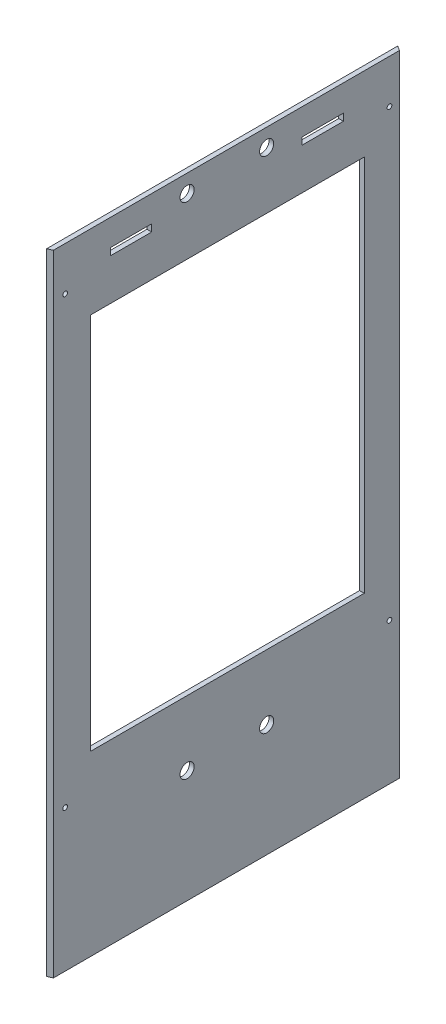
ISO-10303-21;
HEADER;
FILE_DESCRIPTION(('STEP AP214'),'2;1');
FILE_NAME('part.step','',(''),(''),'','','');
FILE_SCHEMA(('AUTOMOTIVE_DESIGN { 1 0 10303 214 1 1 1 1 }'));
ENDSEC;
DATA;
#1=APPLICATION_CONTEXT('core data for automotive mechanical design processes');
#2=APPLICATION_PROTOCOL_DEFINITION('international standard','automotive_design',2000,#1);
#3=PRODUCT_CONTEXT('',#1,'mechanical');
#4=PRODUCT('Part','Part','',(#3));
#5=PRODUCT_RELATED_PRODUCT_CATEGORY('part','',(#4));
#6=PRODUCT_DEFINITION_FORMATION('','',#4);
#7=PRODUCT_DEFINITION_CONTEXT('part definition',#1,'design');
#8=PRODUCT_DEFINITION('design','',#6,#7);
#9=PRODUCT_DEFINITION_SHAPE('','',#8);
#10=(LENGTH_UNIT() NAMED_UNIT(*) SI_UNIT(.MILLI.,.METRE.));
#11=(NAMED_UNIT(*) PLANE_ANGLE_UNIT() SI_UNIT($,.RADIAN.));
#12=(NAMED_UNIT(*) SI_UNIT($,.STERADIAN.) SOLID_ANGLE_UNIT());
#13=UNCERTAINTY_MEASURE_WITH_UNIT(LENGTH_MEASURE(1.E-05),#10,'distance_accuracy_value','');
#14=(GEOMETRIC_REPRESENTATION_CONTEXT(3) GLOBAL_UNCERTAINTY_ASSIGNED_CONTEXT((#13)) GLOBAL_UNIT_ASSIGNED_CONTEXT((#10,
#11,#12)) REPRESENTATION_CONTEXT('',''));
#15=CARTESIAN_POINT('',(0.,0.,0.));
#16=DIRECTION('',(0.,0.,1.));
#17=DIRECTION('',(1.,0.,0.));
#18=AXIS2_PLACEMENT_3D('',#15,#16,#17);
#19=CARTESIAN_POINT('',(0.,831.128163857922,0.));
#20=DIRECTION('',(1.,0.,0.));
#21=DIRECTION('',(0.,0.,-1.));
#22=AXIS2_PLACEMENT_3D('',#19,#20,#21);
#23=PLANE('',#22);
#24=CARTESIAN_POINT('',(0.,120.,-11.7241962206973));
#25=DIRECTION('',(-1.,0.,0.));
#26=DIRECTION('',(0.,0.,-1.));
#27=AXIS2_PLACEMENT_3D('',#24,#25,#26);
#28=CIRCLE('',#27,2.);
#29=CARTESIAN_POINT('',(0.,120.,-13.7241962206973));
#30=VERTEX_POINT('',#29);
#31=EDGE_CURVE('E391',#30,#30,#28,.T.);
#32=ORIENTED_EDGE('',*,*,#31,.F.);
#33=EDGE_LOOP('',(#32));
#34=FACE_BOUND('',#33,.T.);
#35=CARTESIAN_POINT('',(0.,120.,-286.387590837121));
#36=DIRECTION('',(-1.,0.,0.));
#37=DIRECTION('',(0.,0.,1.));
#38=AXIS2_PLACEMENT_3D('',#35,#36,#37);
#39=CIRCLE('',#38,2.);
#40=CARTESIAN_POINT('',(0.,120.,-284.387590837121));
#41=VERTEX_POINT('',#40);
#42=EDGE_CURVE('E393',#41,#41,#39,.T.);
#43=ORIENTED_EDGE('',*,*,#42,.F.);
#44=EDGE_LOOP('',(#43));
#45=FACE_BOUND('',#44,.T.);
#46=CARTESIAN_POINT('',(0.,496.713673316679,-11.7241962206973));
#47=DIRECTION('',(-1.,0.,0.));
#48=DIRECTION('',(0.,0.,-1.));
#49=AXIS2_PLACEMENT_3D('',#46,#47,#48);
#50=CIRCLE('',#49,2.);
#51=CARTESIAN_POINT('',(0.,496.713673316679,-13.7241962206973));
#52=VERTEX_POINT('',#51);
#53=EDGE_CURVE('E399',#52,#52,#50,.T.);
#54=ORIENTED_EDGE('',*,*,#53,.F.);
#55=EDGE_LOOP('',(#54));
#56=FACE_BOUND('',#55,.T.);
#57=CARTESIAN_POINT('',(0.,496.713673316679,-286.387590837121));
#58=DIRECTION('',(-1.,0.,0.));
#59=DIRECTION('',(0.,0.,1.));
#60=AXIS2_PLACEMENT_3D('',#57,#58,#59);
#61=CIRCLE('',#60,2.);
#62=CARTESIAN_POINT('',(0.,496.713673316679,-284.387590837121));
#63=VERTEX_POINT('',#62);
#64=EDGE_CURVE('E405',#63,#63,#61,.T.);
#65=ORIENTED_EDGE('',*,*,#64,.F.);
#66=EDGE_LOOP('',(#65));
#67=FACE_BOUND('',#66,.T.);
#68=CARTESIAN_POINT('',(0.,95.5,-115.));
#69=DIRECTION('',(-1.,0.,0.));
#70=DIRECTION('',(0.,0.,1.));
#71=AXIS2_PLACEMENT_3D('',#68,#69,#70);
#72=CIRCLE('',#71,6.);
#73=CARTESIAN_POINT('',(0.,95.5,-109.));
#74=VERTEX_POINT('',#73);
#75=EDGE_CURVE('E411',#74,#74,#72,.T.);
#76=ORIENTED_EDGE('',*,*,#75,.F.);
#77=EDGE_LOOP('',(#76));
#78=FACE_BOUND('',#77,.T.);
#79=CARTESIAN_POINT('',(0.,95.5,-182.387590837121));
#80=DIRECTION('',(-1.,0.,0.));
#81=DIRECTION('',(0.,0.,1.));
#82=AXIS2_PLACEMENT_3D('',#79,#80,#81);
#83=CIRCLE('',#82,6.00000000000002);
#84=CARTESIAN_POINT('',(0.,95.5,-176.387590837121));
#85=VERTEX_POINT('',#84);
#86=EDGE_CURVE('E417',#85,#85,#83,.T.);
#87=ORIENTED_EDGE('',*,*,#86,.F.);
#88=EDGE_LOOP('',(#87));
#89=FACE_BOUND('',#88,.T.);
#90=CARTESIAN_POINT('',(0.,518.713673316679,-115.));
#91=DIRECTION('',(-1.,0.,0.));
#92=DIRECTION('',(0.,0.,1.));
#93=AXIS2_PLACEMENT_3D('',#90,#91,#92);
#94=CIRCLE('',#93,6.);
#95=CARTESIAN_POINT('',(0.,518.713673316679,-109.));
#96=VERTEX_POINT('',#95);
#97=EDGE_CURVE('E423',#96,#96,#94,.T.);
#98=ORIENTED_EDGE('',*,*,#97,.F.);
#99=EDGE_LOOP('',(#98));
#100=FACE_BOUND('',#99,.T.);
#101=CARTESIAN_POINT('',(0.,518.713673316679,-182.387590837121));
#102=DIRECTION('',(-1.,0.,0.));
#103=DIRECTION('',(0.,0.,1.));
#104=AXIS2_PLACEMENT_3D('',#101,#102,#103);
#105=CIRCLE('',#104,6.00000000000002);
#106=CARTESIAN_POINT('',(0.,518.713673316679,-176.387590837121));
#107=VERTEX_POINT('',#106);
#108=EDGE_CURVE('E172',#107,#107,#105,.T.);
#109=ORIENTED_EDGE('',*,*,#108,.F.);
#110=EDGE_LOOP('',(#109));
#111=FACE_BOUND('',#110,.T.);
#112=DIRECTION('',(0.,1.,0.));
#113=VECTOR('',#112,1.);
#114=CARTESIAN_POINT('',(0.,505.500000000006,-50.));
#115=LINE('',#114,#113);
#116=CARTESIAN_POINT('',(0.,505.500000000006,-50.));
#117=VERTEX_POINT('',#116);
#118=CARTESIAN_POINT('',(0.,511.5,-50.));
#119=VERTEX_POINT('',#118);
#120=EDGE_CURVE('E178',#117,#119,#115,.T.);
#121=ORIENTED_EDGE('',*,*,#120,.F.);
#122=DIRECTION('',(0.,1.74463618155382E-13,1.));
#123=VECTOR('',#122,1.);
#124=CARTESIAN_POINT('',(0.,505.500000000006,-50.));
#125=LINE('',#124,#123);
#126=CARTESIAN_POINT('',(0.,505.5,-85.));
#127=VERTEX_POINT('',#126);
#128=EDGE_CURVE('E50',#127,#117,#125,.T.);
#129=ORIENTED_EDGE('',*,*,#128,.F.);
#130=DIRECTION('',(0.,-1.,0.));
#131=VECTOR('',#130,1.);
#132=CARTESIAN_POINT('',(0.,505.5,-85.));
#133=LINE('',#132,#131);
#134=CARTESIAN_POINT('',(0.,511.5,-85.));
#135=VERTEX_POINT('',#134);
#136=EDGE_CURVE('E166',#135,#127,#133,.T.);
#137=ORIENTED_EDGE('',*,*,#136,.F.);
#138=DIRECTION('',(0.,0.,-1.));
#139=VECTOR('',#138,1.);
#140=CARTESIAN_POINT('',(0.,511.5,-50.));
#141=LINE('',#140,#139);
#142=EDGE_CURVE('E169',#119,#135,#141,.T.);
#143=ORIENTED_EDGE('',*,*,#142,.F.);
#144=EDGE_LOOP('',(#121,#129,#137,#143));
#145=FACE_BOUND('',#144,.T.);
#146=DIRECTION('',(0.,-1.74463618155382E-13,1.));
#147=VECTOR('',#146,1.);
#148=CARTESIAN_POINT('',(0.,505.500000000006,-247.387590837121));
#149=LINE('',#148,#147);
#150=CARTESIAN_POINT('',(0.,505.500000000006,-247.387590837121));
#151=VERTEX_POINT('',#150);
#152=CARTESIAN_POINT('',(0.,505.5,-212.387590837121));
#153=VERTEX_POINT('',#152);
#154=EDGE_CURVE('E204',#151,#153,#149,.T.);
#155=ORIENTED_EDGE('',*,*,#154,.F.);
#156=DIRECTION('',(0.,-1.,0.));
#157=VECTOR('',#156,1.);
#158=CARTESIAN_POINT('',(0.,505.500000000006,-247.387590837121));
#159=LINE('',#158,#157);
#160=CARTESIAN_POINT('',(0.,511.5,-247.387590837121));
#161=VERTEX_POINT('',#160);
#162=EDGE_CURVE('E185',#161,#151,#159,.T.);
#163=ORIENTED_EDGE('',*,*,#162,.F.);
#164=DIRECTION('',(0.,0.,-1.));
#165=VECTOR('',#164,1.);
#166=CARTESIAN_POINT('',(0.,511.5,-247.387590837121));
#167=LINE('',#166,#165);
#168=CARTESIAN_POINT('',(0.,511.5,-212.387590837121));
#169=VERTEX_POINT('',#168);
#170=EDGE_CURVE('E193',#169,#161,#167,.T.);
#171=ORIENTED_EDGE('',*,*,#170,.F.);
#172=DIRECTION('',(0.,1.,0.));
#173=VECTOR('',#172,1.);
#174=CARTESIAN_POINT('',(0.,505.5,-212.387590837121));
#175=LINE('',#174,#173);
#176=EDGE_CURVE('E207',#153,#169,#175,.T.);
#177=ORIENTED_EDGE('',*,*,#176,.F.);
#178=EDGE_LOOP('',(#155,#163,#171,#177));
#179=FACE_BOUND('',#178,.T.);
#180=DIRECTION('',(0.,0.,1.));
#181=VECTOR('',#180,1.);
#182=CARTESIAN_POINT('',(0.,150.5,-33.0558935288884));
#183=LINE('',#182,#181);
#184=CARTESIAN_POINT('',(0.,150.5,-265.055893528888));
#185=VERTEX_POINT('',#184);
#186=CARTESIAN_POINT('',(0.,150.5,-33.0558935288884));
#187=VERTEX_POINT('',#186);
#188=EDGE_CURVE('E236',#185,#187,#183,.T.);
#189=ORIENTED_EDGE('',*,*,#188,.F.);
#190=DIRECTION('',(0.,-1.,0.));
#191=VECTOR('',#190,1.);
#192=CARTESIAN_POINT('',(0.,150.5,-265.055893528888));
#193=LINE('',#192,#191);
#194=CARTESIAN_POINT('',(0.,470.5,-265.055893528888));
#195=VERTEX_POINT('',#194);
#196=EDGE_CURVE('E214',#195,#185,#193,.T.);
#197=ORIENTED_EDGE('',*,*,#196,.F.);
#198=DIRECTION('',(0.,0.,-1.));
#199=VECTOR('',#198,1.);
#200=CARTESIAN_POINT('',(0.,470.5,-33.0558935288884));
#201=LINE('',#200,#199);
#202=CARTESIAN_POINT('',(0.,470.5,-33.0558935288884));
#203=VERTEX_POINT('',#202);
#204=EDGE_CURVE('E225',#203,#195,#201,.T.);
#205=ORIENTED_EDGE('',*,*,#204,.F.);
#206=DIRECTION('',(0.,1.,0.));
#207=VECTOR('',#206,1.);
#208=CARTESIAN_POINT('',(0.,150.5,-33.0558935288884));
#209=LINE('',#208,#207);
#210=EDGE_CURVE('E239',#187,#203,#209,.T.);
#211=ORIENTED_EDGE('',*,*,#210,.F.);
#212=EDGE_LOOP('',(#189,#197,#205,#211));
#213=FACE_BOUND('',#212,.T.);
#214=DIRECTION('',(0.,0.,1.));
#215=VECTOR('',#214,1.);
#216=CARTESIAN_POINT('',(0.,533.713673316679,0.));
#217=LINE('',#216,#215);
#218=CARTESIAN_POINT('',(0.,533.713673316679,-297.387590837121));
#219=VERTEX_POINT('',#218);
#220=CARTESIAN_POINT('',(0.,533.713673316679,0.));
#221=VERTEX_POINT('',#220);
#222=EDGE_CURVE('E270',#219,#221,#217,.T.);
#223=ORIENTED_EDGE('',*,*,#222,.F.);
#224=DIRECTION('',(0.,-1.,0.));
#225=VECTOR('',#224,1.);
#226=CARTESIAN_POINT('',(0.,831.128163857922,-297.387590837121));
#227=LINE('',#226,#225);
#228=CARTESIAN_POINT('',(0.,0.,-297.387590837121));
#229=VERTEX_POINT('',#228);
#230=EDGE_CURVE('E37',#219,#229,#227,.T.);
#231=ORIENTED_EDGE('',*,*,#230,.T.);
#232=DIRECTION('',(0.,0.,1.));
#233=VECTOR('',#232,1.);
#234=CARTESIAN_POINT('',(0.,0.,0.));
#235=LINE('',#234,#233);
#236=CARTESIAN_POINT('',(0.,0.,0.));
#237=VERTEX_POINT('',#236);
#238=EDGE_CURVE('E265',#229,#237,#235,.T.);
#239=ORIENTED_EDGE('',*,*,#238,.T.);
#240=DIRECTION('',(0.,-1.,0.));
#241=VECTOR('',#240,1.);
#242=CARTESIAN_POINT('',(0.,831.128163857922,0.));
#243=LINE('',#242,#241);
#244=EDGE_CURVE('E264',#221,#237,#243,.T.);
#245=ORIENTED_EDGE('',*,*,#244,.F.);
#246=EDGE_LOOP('',(#223,#231,#239,#245));
#247=FACE_BOUND('',#246,.T.);
#248=ADVANCED_FACE('F33',(#34,#45,#56,#67,#78,#89,#100,#111,#145,#179,#213,#247),#23,.F.);
#249=CARTESIAN_POINT('',(0.,831.128163857922,0.));
#250=DIRECTION('',(-0.403602443988454,0.,-0.914934460607178));
#251=DIRECTION('',(-0.914934460607178,0.,0.403602443988454));
#252=AXIS2_PLACEMENT_3D('',#249,#250,#251);
#253=PLANE('',#252);
#254=DIRECTION('',(0.914934460607178,0.,-0.403602443988454));
#255=VECTOR('',#254,1.);
#256=CARTESIAN_POINT('',(0.,533.713673316679,0.));
#257=LINE('',#256,#255);
#258=CARTESIAN_POINT('',(4.,533.713673316679,-1.76450865658994));
#259=VERTEX_POINT('',#258);
#260=EDGE_CURVE('E42',#221,#259,#257,.T.);
#261=ORIENTED_EDGE('',*,*,#260,.F.);
#262=ORIENTED_EDGE('',*,*,#244,.T.);
#263=DIRECTION('',(0.914934460607178,0.,-0.403602443988454));
#264=VECTOR('',#263,1.);
#265=CARTESIAN_POINT('',(0.,0.,0.));
#266=LINE('',#265,#264);
#267=CARTESIAN_POINT('',(4.,0.,-1.76450865658994));
#268=VERTEX_POINT('',#267);
#269=EDGE_CURVE('E261',#237,#268,#266,.T.);
#270=ORIENTED_EDGE('',*,*,#269,.T.);
#271=DIRECTION('',(0.,-1.,0.));
#272=VECTOR('',#271,1.);
#273=CARTESIAN_POINT('',(4.,831.128163857922,-1.76450865658994));
#274=LINE('',#273,#272);
#275=EDGE_CURVE('E260',#259,#268,#274,.T.);
#276=ORIENTED_EDGE('',*,*,#275,.F.);
#277=EDGE_LOOP('',(#261,#262,#270,#276));
#278=FACE_BOUND('',#277,.T.);
#279=ADVANCED_FACE('F292',(#278),#253,.F.);
#280=CARTESIAN_POINT('',(4.,831.128163857922,-1.76450865658994));
#281=DIRECTION('',(-1.,0.,0.));
#282=DIRECTION('',(0.,0.,1.));
#283=AXIS2_PLACEMENT_3D('',#280,#281,#282);
#284=PLANE('',#283);
#285=CARTESIAN_POINT('',(4.,120.,-11.7241962206973));
#286=DIRECTION('',(-1.,0.,0.));
#287=DIRECTION('',(0.,0.,-1.));
#288=AXIS2_PLACEMENT_3D('',#285,#286,#287);
#289=CIRCLE('',#288,2.);
#290=CARTESIAN_POINT('',(4.,120.,-13.7241962206973));
#291=VERTEX_POINT('',#290);
#292=EDGE_CURVE('E388',#291,#291,#289,.T.);
#293=ORIENTED_EDGE('',*,*,#292,.T.);
#294=EDGE_LOOP('',(#293));
#295=FACE_BOUND('',#294,.T.);
#296=CARTESIAN_POINT('',(4.,120.,-286.387590837121));
#297=DIRECTION('',(-1.,0.,0.));
#298=DIRECTION('',(0.,0.,1.));
#299=AXIS2_PLACEMENT_3D('',#296,#297,#298);
#300=CIRCLE('',#299,2.);
#301=CARTESIAN_POINT('',(4.,120.,-284.387590837121));
#302=VERTEX_POINT('',#301);
#303=EDGE_CURVE('E396',#302,#302,#300,.T.);
#304=ORIENTED_EDGE('',*,*,#303,.T.);
#305=EDGE_LOOP('',(#304));
#306=FACE_BOUND('',#305,.T.);
#307=CARTESIAN_POINT('',(4.,496.713673316679,-11.7241962206973));
#308=DIRECTION('',(-1.,0.,0.));
#309=DIRECTION('',(0.,0.,-1.));
#310=AXIS2_PLACEMENT_3D('',#307,#308,#309);
#311=CIRCLE('',#310,2.);
#312=CARTESIAN_POINT('',(4.,496.713673316679,-13.7241962206973));
#313=VERTEX_POINT('',#312);
#314=EDGE_CURVE('E402',#313,#313,#311,.T.);
#315=ORIENTED_EDGE('',*,*,#314,.T.);
#316=EDGE_LOOP('',(#315));
#317=FACE_BOUND('',#316,.T.);
#318=CARTESIAN_POINT('',(4.,496.713673316679,-286.387590837121));
#319=DIRECTION('',(-1.,0.,0.));
#320=DIRECTION('',(0.,0.,1.));
#321=AXIS2_PLACEMENT_3D('',#318,#319,#320);
#322=CIRCLE('',#321,2.);
#323=CARTESIAN_POINT('',(4.,496.713673316679,-284.387590837121));
#324=VERTEX_POINT('',#323);
#325=EDGE_CURVE('E408',#324,#324,#322,.T.);
#326=ORIENTED_EDGE('',*,*,#325,.T.);
#327=EDGE_LOOP('',(#326));
#328=FACE_BOUND('',#327,.T.);
#329=CARTESIAN_POINT('',(4.,95.5,-115.));
#330=DIRECTION('',(-1.,0.,0.));
#331=DIRECTION('',(0.,0.,1.));
#332=AXIS2_PLACEMENT_3D('',#329,#330,#331);
#333=CIRCLE('',#332,6.);
#334=CARTESIAN_POINT('',(4.,95.5,-109.));
#335=VERTEX_POINT('',#334);
#336=EDGE_CURVE('E414',#335,#335,#333,.T.);
#337=ORIENTED_EDGE('',*,*,#336,.T.);
#338=EDGE_LOOP('',(#337));
#339=FACE_BOUND('',#338,.T.);
#340=CARTESIAN_POINT('',(4.,95.5,-182.387590837121));
#341=DIRECTION('',(-1.,0.,0.));
#342=DIRECTION('',(0.,0.,1.));
#343=AXIS2_PLACEMENT_3D('',#340,#341,#342);
#344=CIRCLE('',#343,6.00000000000002);
#345=CARTESIAN_POINT('',(4.,95.5,-176.387590837121));
#346=VERTEX_POINT('',#345);
#347=EDGE_CURVE('E420',#346,#346,#344,.T.);
#348=ORIENTED_EDGE('',*,*,#347,.T.);
#349=EDGE_LOOP('',(#348));
#350=FACE_BOUND('',#349,.T.);
#351=CARTESIAN_POINT('',(4.,518.713673316679,-115.));
#352=DIRECTION('',(-1.,0.,0.));
#353=DIRECTION('',(0.,0.,1.));
#354=AXIS2_PLACEMENT_3D('',#351,#352,#353);
#355=CIRCLE('',#354,6.);
#356=CARTESIAN_POINT('',(4.,518.713673316679,-109.));
#357=VERTEX_POINT('',#356);
#358=EDGE_CURVE('E426',#357,#357,#355,.T.);
#359=ORIENTED_EDGE('',*,*,#358,.T.);
#360=EDGE_LOOP('',(#359));
#361=FACE_BOUND('',#360,.T.);
#362=CARTESIAN_POINT('',(4.,518.713673316679,-182.387590837121));
#363=DIRECTION('',(-1.,0.,0.));
#364=DIRECTION('',(0.,0.,1.));
#365=AXIS2_PLACEMENT_3D('',#362,#363,#364);
#366=CIRCLE('',#365,6.00000000000002);
#367=CARTESIAN_POINT('',(4.,518.713673316679,-176.387590837121));
#368=VERTEX_POINT('',#367);
#369=EDGE_CURVE('E179',#368,#368,#366,.T.);
#370=ORIENTED_EDGE('',*,*,#369,.T.);
#371=EDGE_LOOP('',(#370));
#372=FACE_BOUND('',#371,.T.);
#373=DIRECTION('',(0.,-1.,0.));
#374=VECTOR('',#373,1.);
#375=CARTESIAN_POINT('',(4.,505.5,-85.));
#376=LINE('',#375,#374);
#377=CARTESIAN_POINT('',(4.,511.5,-85.));
#378=VERTEX_POINT('',#377);
#379=CARTESIAN_POINT('',(4.,505.5,-85.));
#380=VERTEX_POINT('',#379);
#381=EDGE_CURVE('E156',#378,#380,#376,.T.);
#382=ORIENTED_EDGE('',*,*,#381,.T.);
#383=DIRECTION('',(0.,1.74463618155382E-13,1.));
#384=VECTOR('',#383,1.);
#385=CARTESIAN_POINT('',(4.,505.500000000006,-50.));
#386=LINE('',#385,#384);
#387=CARTESIAN_POINT('',(4.,505.500000000006,-50.));
#388=VERTEX_POINT('',#387);
#389=EDGE_CURVE('E150',#380,#388,#386,.T.);
#390=ORIENTED_EDGE('',*,*,#389,.T.);
#391=DIRECTION('',(0.,1.,0.));
#392=VECTOR('',#391,1.);
#393=CARTESIAN_POINT('',(4.,505.500000000006,-50.));
#394=LINE('',#393,#392);
#395=CARTESIAN_POINT('',(4.,511.5,-50.));
#396=VERTEX_POINT('',#395);
#397=EDGE_CURVE('E159',#388,#396,#394,.T.);
#398=ORIENTED_EDGE('',*,*,#397,.T.);
#399=DIRECTION('',(0.,0.,-1.));
#400=VECTOR('',#399,1.);
#401=CARTESIAN_POINT('',(4.,511.5,-50.));
#402=LINE('',#401,#400);
#403=EDGE_CURVE('E58',#396,#378,#402,.T.);
#404=ORIENTED_EDGE('',*,*,#403,.T.);
#405=EDGE_LOOP('',(#382,#390,#398,#404));
#406=FACE_BOUND('',#405,.T.);
#407=DIRECTION('',(0.,0.,-1.));
#408=VECTOR('',#407,1.);
#409=CARTESIAN_POINT('',(4.,511.5,-247.387590837121));
#410=LINE('',#409,#408);
#411=CARTESIAN_POINT('',(4.,511.5,-212.387590837121));
#412=VERTEX_POINT('',#411);
#413=CARTESIAN_POINT('',(4.,511.5,-247.387590837121));
#414=VERTEX_POINT('',#413);
#415=EDGE_CURVE('E199',#412,#414,#410,.T.);
#416=ORIENTED_EDGE('',*,*,#415,.T.);
#417=DIRECTION('',(0.,-1.,0.));
#418=VECTOR('',#417,1.);
#419=CARTESIAN_POINT('',(4.,505.500000000006,-247.387590837121));
#420=LINE('',#419,#418);
#421=CARTESIAN_POINT('',(4.,505.500000000006,-247.387590837121));
#422=VERTEX_POINT('',#421);
#423=EDGE_CURVE('E189',#414,#422,#420,.T.);
#424=ORIENTED_EDGE('',*,*,#423,.T.);
#425=DIRECTION('',(0.,-1.74463618155382E-13,1.));
#426=VECTOR('',#425,1.);
#427=CARTESIAN_POINT('',(4.,505.500000000006,-247.387590837121));
#428=LINE('',#427,#426);
#429=CARTESIAN_POINT('',(4.,505.5,-212.387590837121));
#430=VERTEX_POINT('',#429);
#431=EDGE_CURVE('E192',#422,#430,#428,.T.);
#432=ORIENTED_EDGE('',*,*,#431,.T.);
#433=DIRECTION('',(0.,1.,0.));
#434=VECTOR('',#433,1.);
#435=CARTESIAN_POINT('',(4.,505.5,-212.387590837121));
#436=LINE('',#435,#434);
#437=EDGE_CURVE('E196',#430,#412,#436,.T.);
#438=ORIENTED_EDGE('',*,*,#437,.T.);
#439=EDGE_LOOP('',(#416,#424,#432,#438));
#440=FACE_BOUND('',#439,.T.);
#441=DIRECTION('',(0.,0.,-1.));
#442=VECTOR('',#441,1.);
#443=CARTESIAN_POINT('',(4.,470.5,-33.0558935288884));
#444=LINE('',#443,#442);
#445=CARTESIAN_POINT('',(4.,470.5,-33.0558935288884));
#446=VERTEX_POINT('',#445);
#447=CARTESIAN_POINT('',(4.,470.5,-265.055893528888));
#448=VERTEX_POINT('',#447);
#449=EDGE_CURVE('E231',#446,#448,#444,.T.);
#450=ORIENTED_EDGE('',*,*,#449,.T.);
#451=DIRECTION('',(0.,-1.,0.));
#452=VECTOR('',#451,1.);
#453=CARTESIAN_POINT('',(4.,150.5,-265.055893528888));
#454=LINE('',#453,#452);
#455=CARTESIAN_POINT('',(4.,150.5,-265.055893528888));
#456=VERTEX_POINT('',#455);
#457=EDGE_CURVE('E221',#448,#456,#454,.T.);
#458=ORIENTED_EDGE('',*,*,#457,.T.);
#459=DIRECTION('',(0.,0.,1.));
#460=VECTOR('',#459,1.);
#461=CARTESIAN_POINT('',(4.,150.5,-33.0558935288884));
#462=LINE('',#461,#460);
#463=CARTESIAN_POINT('',(4.,150.5,-33.0558935288884));
#464=VERTEX_POINT('',#463);
#465=EDGE_CURVE('E224',#456,#464,#462,.T.);
#466=ORIENTED_EDGE('',*,*,#465,.T.);
#467=DIRECTION('',(0.,1.,0.));
#468=VECTOR('',#467,1.);
#469=CARTESIAN_POINT('',(4.,150.5,-33.0558935288884));
#470=LINE('',#469,#468);
#471=EDGE_CURVE('E228',#464,#446,#470,.T.);
#472=ORIENTED_EDGE('',*,*,#471,.T.);
#473=EDGE_LOOP('',(#450,#458,#466,#472));
#474=FACE_BOUND('',#473,.T.);
#475=DIRECTION('',(0.,0.,-1.));
#476=VECTOR('',#475,1.);
#477=CARTESIAN_POINT('',(4.,533.713673316679,-1.76450865658999));
#478=LINE('',#477,#476);
#479=CARTESIAN_POINT('',(4.,533.713673316679,-294.827324918367));
#480=VERTEX_POINT('',#479);
#481=EDGE_CURVE('E11',#259,#480,#478,.T.);
#482=ORIENTED_EDGE('',*,*,#481,.F.);
#483=ORIENTED_EDGE('',*,*,#275,.T.);
#484=DIRECTION('',(0.,0.,-1.));
#485=VECTOR('',#484,1.);
#486=CARTESIAN_POINT('',(4.,0.,-1.76450865658994));
#487=LINE('',#486,#485);
#488=CARTESIAN_POINT('',(4.,0.,-294.827324918367));
#489=VERTEX_POINT('',#488);
#490=EDGE_CURVE('E257',#268,#489,#487,.T.);
#491=ORIENTED_EDGE('',*,*,#490,.T.);
#492=DIRECTION('',(0.,-1.,0.));
#493=VECTOR('',#492,1.);
#494=CARTESIAN_POINT('',(4.,831.128163857922,-294.827324918367));
#495=LINE('',#494,#493);
#496=EDGE_CURVE('E256',#480,#489,#495,.T.);
#497=ORIENTED_EDGE('',*,*,#496,.F.);
#498=EDGE_LOOP('',(#482,#483,#491,#497));
#499=FACE_BOUND('',#498,.T.);
#500=ADVANCED_FACE('F163',(#295,#306,#317,#328,#339,#350,#361,#372,#406,#440,#474,#499),#284,.F.);
#501=CARTESIAN_POINT('',(0.,831.128163857922,-297.387590837121));
#502=DIRECTION('',(-0.539093417908417,0.,0.842245977590763));
#503=DIRECTION('',(0.842245977590763,0.,0.539093417908417));
#504=AXIS2_PLACEMENT_3D('',#501,#502,#503);
#505=PLANE('',#504);
#506=DIRECTION('',(-0.842245977590763,0.,-0.539093417908417));
#507=VECTOR('',#506,1.);
#508=CARTESIAN_POINT('',(0.,533.713673316679,-297.387590837121));
#509=LINE('',#508,#507);
#510=EDGE_CURVE('E255',#480,#219,#509,.T.);
#511=ORIENTED_EDGE('',*,*,#510,.F.);
#512=ORIENTED_EDGE('',*,*,#496,.T.);
#513=DIRECTION('',(-0.842245977590763,0.,-0.539093417908417));
#514=VECTOR('',#513,1.);
#515=CARTESIAN_POINT('',(0.,0.,-297.387590837121));
#516=LINE('',#515,#514);
#517=EDGE_CURVE('E252',#489,#229,#516,.T.);
#518=ORIENTED_EDGE('',*,*,#517,.T.);
#519=ORIENTED_EDGE('',*,*,#230,.F.);
#520=EDGE_LOOP('',(#511,#512,#518,#519));
#521=FACE_BOUND('',#520,.T.);
#522=ADVANCED_FACE('F278',(#521),#505,.F.);
#523=CARTESIAN_POINT('',(0.,0.,0.));
#524=DIRECTION('',(0.,-1.,0.));
#525=DIRECTION('',(0.,0.,-1.));
#526=AXIS2_PLACEMENT_3D('',#523,#524,#525);
#527=PLANE('',#526);
#528=ORIENTED_EDGE('',*,*,#238,.F.);
#529=ORIENTED_EDGE('',*,*,#517,.F.);
#530=ORIENTED_EDGE('',*,*,#490,.F.);
#531=ORIENTED_EDGE('',*,*,#269,.F.);
#532=EDGE_LOOP('',(#528,#529,#530,#531));
#533=FACE_BOUND('',#532,.T.);
#534=ADVANCED_FACE('F286',(#533),#527,.T.);
#535=CARTESIAN_POINT('',(417.313914596998,533.713673316679,-106.757731009328));
#536=DIRECTION('',(0.,1.,0.));
#537=DIRECTION('',(0.,0.,-1.));
#538=AXIS2_PLACEMENT_3D('',#535,#536,#537);
#539=PLANE('',#538);
#540=ORIENTED_EDGE('',*,*,#510,.T.);
#541=ORIENTED_EDGE('',*,*,#222,.T.);
#542=ORIENTED_EDGE('',*,*,#260,.T.);
#543=ORIENTED_EDGE('',*,*,#481,.T.);
#544=EDGE_LOOP('',(#540,#541,#542,#543));
#545=FACE_BOUND('',#544,.T.);
#546=ADVANCED_FACE('F35',(#545),#539,.T.);
#547=CARTESIAN_POINT('',(4.,150.5,-265.055893528888));
#548=DIRECTION('',(0.,0.,-1.));
#549=DIRECTION('',(-1.,0.,0.));
#550=AXIS2_PLACEMENT_3D('',#547,#548,#549);
#551=PLANE('',#550);
#552=ORIENTED_EDGE('',*,*,#196,.T.);
#553=DIRECTION('',(-1.,0.,0.));
#554=VECTOR('',#553,1.);
#555=CARTESIAN_POINT('',(4.,150.5,-265.055893528888));
#556=LINE('',#555,#554);
#557=EDGE_CURVE('E234',#456,#185,#556,.T.);
#558=ORIENTED_EDGE('',*,*,#557,.F.);
#559=ORIENTED_EDGE('',*,*,#457,.F.);
#560=DIRECTION('',(-1.,0.,0.));
#561=VECTOR('',#560,1.);
#562=CARTESIAN_POINT('',(4.,470.5,-265.055893528888));
#563=LINE('',#562,#561);
#564=EDGE_CURVE('E244',#448,#195,#563,.T.);
#565=ORIENTED_EDGE('',*,*,#564,.T.);
#566=EDGE_LOOP('',(#552,#558,#559,#565));
#567=FACE_BOUND('',#566,.T.);
#568=ADVANCED_FACE('F309',(#567),#551,.F.);
#569=CARTESIAN_POINT('',(4.,470.5,-33.0558935288884));
#570=DIRECTION('',(0.,1.,0.));
#571=DIRECTION('',(0.,0.,1.));
#572=AXIS2_PLACEMENT_3D('',#569,#570,#571);
#573=PLANE('',#572);
#574=ORIENTED_EDGE('',*,*,#204,.T.);
#575=ORIENTED_EDGE('',*,*,#564,.F.);
#576=ORIENTED_EDGE('',*,*,#449,.F.);
#577=DIRECTION('',(-1.,0.,0.));
#578=VECTOR('',#577,1.);
#579=CARTESIAN_POINT('',(4.,470.5,-33.0558935288884));
#580=LINE('',#579,#578);
#581=EDGE_CURVE('E246',#446,#203,#580,.T.);
#582=ORIENTED_EDGE('',*,*,#581,.T.);
#583=EDGE_LOOP('',(#574,#575,#576,#582));
#584=FACE_BOUND('',#583,.T.);
#585=ADVANCED_FACE('F312',(#584),#573,.F.);
#586=CARTESIAN_POINT('',(4.,150.5,-33.0558935288884));
#587=DIRECTION('',(0.,0.,1.));
#588=DIRECTION('',(0.,-1.,0.));
#589=AXIS2_PLACEMENT_3D('',#586,#587,#588);
#590=PLANE('',#589);
#591=ORIENTED_EDGE('',*,*,#210,.T.);
#592=ORIENTED_EDGE('',*,*,#581,.F.);
#593=ORIENTED_EDGE('',*,*,#471,.F.);
#594=DIRECTION('',(-1.,0.,0.));
#595=VECTOR('',#594,1.);
#596=CARTESIAN_POINT('',(4.,150.5,-33.0558935288884));
#597=LINE('',#596,#595);
#598=EDGE_CURVE('E248',#464,#187,#597,.T.);
#599=ORIENTED_EDGE('',*,*,#598,.T.);
#600=EDGE_LOOP('',(#591,#592,#593,#599));
#601=FACE_BOUND('',#600,.T.);
#602=ADVANCED_FACE('F318',(#601),#590,.F.);
#603=CARTESIAN_POINT('',(4.,150.5,-33.0558935288884));
#604=DIRECTION('',(0.,-1.,0.));
#605=DIRECTION('',(0.,0.,-1.));
#606=AXIS2_PLACEMENT_3D('',#603,#604,#605);
#607=PLANE('',#606);
#608=ORIENTED_EDGE('',*,*,#188,.T.);
#609=ORIENTED_EDGE('',*,*,#598,.F.);
#610=ORIENTED_EDGE('',*,*,#465,.F.);
#611=ORIENTED_EDGE('',*,*,#557,.T.);
#612=EDGE_LOOP('',(#608,#609,#610,#611));
#613=FACE_BOUND('',#612,.T.);
#614=ADVANCED_FACE('F314',(#613),#607,.F.);
#615=CARTESIAN_POINT('',(4.,505.500000000006,-247.387590837121));
#616=DIRECTION('',(0.,0.,-1.));
#617=DIRECTION('',(0.,1.,0.));
#618=AXIS2_PLACEMENT_3D('',#615,#616,#617);
#619=PLANE('',#618);
#620=ORIENTED_EDGE('',*,*,#162,.T.);
#621=DIRECTION('',(-1.,0.,0.));
#622=VECTOR('',#621,1.);
#623=CARTESIAN_POINT('',(4.,505.500000000006,-247.387590837121));
#624=LINE('',#623,#622);
#625=EDGE_CURVE('E202',#422,#151,#624,.T.);
#626=ORIENTED_EDGE('',*,*,#625,.F.);
#627=ORIENTED_EDGE('',*,*,#423,.F.);
#628=DIRECTION('',(-1.,0.,0.));
#629=VECTOR('',#628,1.);
#630=CARTESIAN_POINT('',(4.,511.5,-247.387590837121));
#631=LINE('',#630,#629);
#632=EDGE_CURVE('E212',#414,#161,#631,.T.);
#633=ORIENTED_EDGE('',*,*,#632,.T.);
#634=EDGE_LOOP('',(#620,#626,#627,#633));
#635=FACE_BOUND('',#634,.T.);
#636=ADVANCED_FACE('F317',(#635),#619,.F.);
#637=CARTESIAN_POINT('',(4.,511.5,-247.387590837121));
#638=DIRECTION('',(0.,1.,0.));
#639=DIRECTION('',(0.,0.,1.));
#640=AXIS2_PLACEMENT_3D('',#637,#638,#639);
#641=PLANE('',#640);
#642=ORIENTED_EDGE('',*,*,#170,.T.);
#643=ORIENTED_EDGE('',*,*,#632,.F.);
#644=ORIENTED_EDGE('',*,*,#415,.F.);
#645=DIRECTION('',(-1.,0.,0.));
#646=VECTOR('',#645,1.);
#647=CARTESIAN_POINT('',(4.,511.5,-212.387590837121));
#648=LINE('',#647,#646);
#649=EDGE_CURVE('E215',#412,#169,#648,.T.);
#650=ORIENTED_EDGE('',*,*,#649,.T.);
#651=EDGE_LOOP('',(#642,#643,#644,#650));
#652=FACE_BOUND('',#651,.T.);
#653=ADVANCED_FACE('F328',(#652),#641,.F.);
#654=CARTESIAN_POINT('',(4.,505.5,-212.387590837121));
#655=DIRECTION('',(0.,0.,1.));
#656=DIRECTION('',(1.,0.,0.));
#657=AXIS2_PLACEMENT_3D('',#654,#655,#656);
#658=PLANE('',#657);
#659=ORIENTED_EDGE('',*,*,#176,.T.);
#660=ORIENTED_EDGE('',*,*,#649,.F.);
#661=ORIENTED_EDGE('',*,*,#437,.F.);
#662=DIRECTION('',(-1.,0.,0.));
#663=VECTOR('',#662,1.);
#664=CARTESIAN_POINT('',(4.,505.5,-212.387590837121));
#665=LINE('',#664,#663);
#666=EDGE_CURVE('E217',#430,#153,#665,.T.);
#667=ORIENTED_EDGE('',*,*,#666,.T.);
#668=EDGE_LOOP('',(#659,#660,#661,#667));
#669=FACE_BOUND('',#668,.T.);
#670=ADVANCED_FACE('F333',(#669),#658,.F.);
#671=CARTESIAN_POINT('',(4.,505.500000000006,-247.387590837121));
#672=DIRECTION('',(0.,-1.,-1.74463618155382E-13));
#673=DIRECTION('',(0.,1.74463618155382E-13,-1.));
#674=AXIS2_PLACEMENT_3D('',#671,#672,#673);
#675=PLANE('',#674);
#676=ORIENTED_EDGE('',*,*,#154,.T.);
#677=ORIENTED_EDGE('',*,*,#666,.F.);
#678=ORIENTED_EDGE('',*,*,#431,.F.);
#679=ORIENTED_EDGE('',*,*,#625,.T.);
#680=EDGE_LOOP('',(#676,#677,#678,#679));
#681=FACE_BOUND('',#680,.T.);
#682=ADVANCED_FACE('F330',(#681),#675,.F.);
#683=CARTESIAN_POINT('',(4.,505.500000000006,-50.));
#684=DIRECTION('',(0.,-1.,1.74463618155382E-13));
#685=DIRECTION('',(0.,-1.74463618155382E-13,-1.));
#686=AXIS2_PLACEMENT_3D('',#683,#684,#685);
#687=PLANE('',#686);
#688=ORIENTED_EDGE('',*,*,#128,.T.);
#689=DIRECTION('',(-1.,0.,0.));
#690=VECTOR('',#689,1.);
#691=CARTESIAN_POINT('',(4.,505.500000000006,-50.));
#692=LINE('',#691,#690);
#693=EDGE_CURVE('E146',#388,#117,#692,.T.);
#694=ORIENTED_EDGE('',*,*,#693,.F.);
#695=ORIENTED_EDGE('',*,*,#389,.F.);
#696=DIRECTION('',(-1.,0.,0.));
#697=VECTOR('',#696,1.);
#698=CARTESIAN_POINT('',(4.,505.5,-85.));
#699=LINE('',#698,#697);
#700=EDGE_CURVE('E183',#380,#127,#699,.T.);
#701=ORIENTED_EDGE('',*,*,#700,.T.);
#702=EDGE_LOOP('',(#688,#694,#695,#701));
#703=FACE_BOUND('',#702,.T.);
#704=ADVANCED_FACE('F148',(#703),#687,.F.);
#705=CARTESIAN_POINT('',(4.,505.5,-85.));
#706=DIRECTION('',(0.,0.,-1.));
#707=DIRECTION('',(-1.,0.,0.));
#708=AXIS2_PLACEMENT_3D('',#705,#706,#707);
#709=PLANE('',#708);
#710=ORIENTED_EDGE('',*,*,#136,.T.);
#711=ORIENTED_EDGE('',*,*,#700,.F.);
#712=ORIENTED_EDGE('',*,*,#381,.F.);
#713=DIRECTION('',(-1.,0.,0.));
#714=VECTOR('',#713,1.);
#715=CARTESIAN_POINT('',(4.,511.5,-85.));
#716=LINE('',#715,#714);
#717=EDGE_CURVE('E186',#378,#135,#716,.T.);
#718=ORIENTED_EDGE('',*,*,#717,.T.);
#719=EDGE_LOOP('',(#710,#711,#712,#718));
#720=FACE_BOUND('',#719,.T.);
#721=ADVANCED_FACE('F343',(#720),#709,.F.);
#722=CARTESIAN_POINT('',(4.,511.5,-50.));
#723=DIRECTION('',(0.,1.,0.));
#724=DIRECTION('',(0.,0.,1.));
#725=AXIS2_PLACEMENT_3D('',#722,#723,#724);
#726=PLANE('',#725);
#727=ORIENTED_EDGE('',*,*,#142,.T.);
#728=ORIENTED_EDGE('',*,*,#717,.F.);
#729=ORIENTED_EDGE('',*,*,#403,.F.);
#730=DIRECTION('',(-1.,0.,0.));
#731=VECTOR('',#730,1.);
#732=CARTESIAN_POINT('',(4.,511.5,-50.));
#733=LINE('',#732,#731);
#734=EDGE_CURVE('E155',#396,#119,#733,.T.);
#735=ORIENTED_EDGE('',*,*,#734,.T.);
#736=EDGE_LOOP('',(#727,#728,#729,#735));
#737=FACE_BOUND('',#736,.T.);
#738=ADVANCED_FACE('F347',(#737),#726,.F.);
#739=CARTESIAN_POINT('',(4.,505.500000000006,-50.));
#740=DIRECTION('',(0.,0.,1.));
#741=DIRECTION('',(0.,-1.,0.));
#742=AXIS2_PLACEMENT_3D('',#739,#740,#741);
#743=PLANE('',#742);
#744=ORIENTED_EDGE('',*,*,#120,.T.);
#745=ORIENTED_EDGE('',*,*,#734,.F.);
#746=ORIENTED_EDGE('',*,*,#397,.F.);
#747=ORIENTED_EDGE('',*,*,#693,.T.);
#748=EDGE_LOOP('',(#744,#745,#746,#747));
#749=FACE_BOUND('',#748,.T.);
#750=ADVANCED_FACE('F160',(#749),#743,.F.);
#751=CARTESIAN_POINT('',(4.,518.713673316679,-182.387590837121));
#752=DIRECTION('',(-1.,0.,0.));
#753=DIRECTION('',(0.,0.,1.));
#754=AXIS2_PLACEMENT_3D('',#751,#752,#753);
#755=CYLINDRICAL_SURFACE('',#754,6.00000000000002);
#756=ORIENTED_EDGE('',*,*,#369,.F.);
#757=EDGE_LOOP('',(#756));
#758=FACE_BOUND('',#757,.T.);
#759=ORIENTED_EDGE('',*,*,#108,.T.);
#760=EDGE_LOOP('',(#759));
#761=FACE_BOUND('',#760,.T.);
#762=ADVANCED_FACE('F346',(#758,#761),#755,.F.);
#763=CARTESIAN_POINT('',(4.,518.713673316679,-115.));
#764=DIRECTION('',(-1.,0.,0.));
#765=DIRECTION('',(0.,0.,1.));
#766=AXIS2_PLACEMENT_3D('',#763,#764,#765);
#767=CYLINDRICAL_SURFACE('',#766,6.);
#768=ORIENTED_EDGE('',*,*,#358,.F.);
#769=EDGE_LOOP('',(#768));
#770=FACE_BOUND('',#769,.T.);
#771=ORIENTED_EDGE('',*,*,#97,.T.);
#772=EDGE_LOOP('',(#771));
#773=FACE_BOUND('',#772,.T.);
#774=ADVANCED_FACE('F355',(#770,#773),#767,.F.);
#775=CARTESIAN_POINT('',(4.,95.5,-182.387590837121));
#776=DIRECTION('',(-1.,0.,0.));
#777=DIRECTION('',(0.,0.,1.));
#778=AXIS2_PLACEMENT_3D('',#775,#776,#777);
#779=CYLINDRICAL_SURFACE('',#778,6.00000000000002);
#780=ORIENTED_EDGE('',*,*,#347,.F.);
#781=EDGE_LOOP('',(#780));
#782=FACE_BOUND('',#781,.T.);
#783=ORIENTED_EDGE('',*,*,#86,.T.);
#784=EDGE_LOOP('',(#783));
#785=FACE_BOUND('',#784,.T.);
#786=ADVANCED_FACE('F359',(#782,#785),#779,.F.);
#787=CARTESIAN_POINT('',(4.,95.5,-115.));
#788=DIRECTION('',(-1.,0.,0.));
#789=DIRECTION('',(0.,0.,1.));
#790=AXIS2_PLACEMENT_3D('',#787,#788,#789);
#791=CYLINDRICAL_SURFACE('',#790,6.);
#792=ORIENTED_EDGE('',*,*,#336,.F.);
#793=EDGE_LOOP('',(#792));
#794=FACE_BOUND('',#793,.T.);
#795=ORIENTED_EDGE('',*,*,#75,.T.);
#796=EDGE_LOOP('',(#795));
#797=FACE_BOUND('',#796,.T.);
#798=ADVANCED_FACE('F363',(#794,#797),#791,.F.);
#799=CARTESIAN_POINT('',(4.,496.713673316679,-286.387590837121));
#800=DIRECTION('',(-1.,0.,0.));
#801=DIRECTION('',(0.,0.,1.));
#802=AXIS2_PLACEMENT_3D('',#799,#800,#801);
#803=CYLINDRICAL_SURFACE('',#802,2.);
#804=ORIENTED_EDGE('',*,*,#325,.F.);
#805=EDGE_LOOP('',(#804));
#806=FACE_BOUND('',#805,.T.);
#807=ORIENTED_EDGE('',*,*,#64,.T.);
#808=EDGE_LOOP('',(#807));
#809=FACE_BOUND('',#808,.T.);
#810=ADVANCED_FACE('F367',(#806,#809),#803,.F.);
#811=CARTESIAN_POINT('',(4.,496.713673316679,-11.7241962206973));
#812=DIRECTION('',(-1.,0.,0.));
#813=DIRECTION('',(0.,0.,1.));
#814=AXIS2_PLACEMENT_3D('',#811,#812,#813);
#815=CYLINDRICAL_SURFACE('',#814,2.);
#816=ORIENTED_EDGE('',*,*,#314,.F.);
#817=EDGE_LOOP('',(#816));
#818=FACE_BOUND('',#817,.T.);
#819=ORIENTED_EDGE('',*,*,#53,.T.);
#820=EDGE_LOOP('',(#819));
#821=FACE_BOUND('',#820,.T.);
#822=ADVANCED_FACE('F371',(#818,#821),#815,.F.);
#823=CARTESIAN_POINT('',(4.,120.,-286.387590837121));
#824=DIRECTION('',(-1.,0.,0.));
#825=DIRECTION('',(0.,0.,1.));
#826=AXIS2_PLACEMENT_3D('',#823,#824,#825);
#827=CYLINDRICAL_SURFACE('',#826,2.);
#828=ORIENTED_EDGE('',*,*,#303,.F.);
#829=EDGE_LOOP('',(#828));
#830=FACE_BOUND('',#829,.T.);
#831=ORIENTED_EDGE('',*,*,#42,.T.);
#832=EDGE_LOOP('',(#831));
#833=FACE_BOUND('',#832,.T.);
#834=ADVANCED_FACE('F375',(#830,#833),#827,.F.);
#835=CARTESIAN_POINT('',(4.,120.,-11.7241962206973));
#836=DIRECTION('',(-1.,0.,0.));
#837=DIRECTION('',(0.,0.,1.));
#838=AXIS2_PLACEMENT_3D('',#835,#836,#837);
#839=CYLINDRICAL_SURFACE('',#838,2.);
#840=ORIENTED_EDGE('',*,*,#292,.F.);
#841=EDGE_LOOP('',(#840));
#842=FACE_BOUND('',#841,.T.);
#843=ORIENTED_EDGE('',*,*,#31,.T.);
#844=EDGE_LOOP('',(#843));
#845=FACE_BOUND('',#844,.T.);
#846=ADVANCED_FACE('F379',(#842,#845),#839,.F.);
#847=CLOSED_SHELL('',(#248,#279,#500,#522,#534,#546,#568,#585,#602,#614,#636,#653,#670,#682,
#704,#721,#738,#750,#762,#774,#786,#798,#810,#822,#834,#846));
#848=MANIFOLD_SOLID_BREP('B2',#847);
#849=ADVANCED_BREP_SHAPE_REPRESENTATION('',(#18,#848),#14);
#850=SHAPE_DEFINITION_REPRESENTATION(#9,#849);
ENDSEC;
END-ISO-10303-21;
